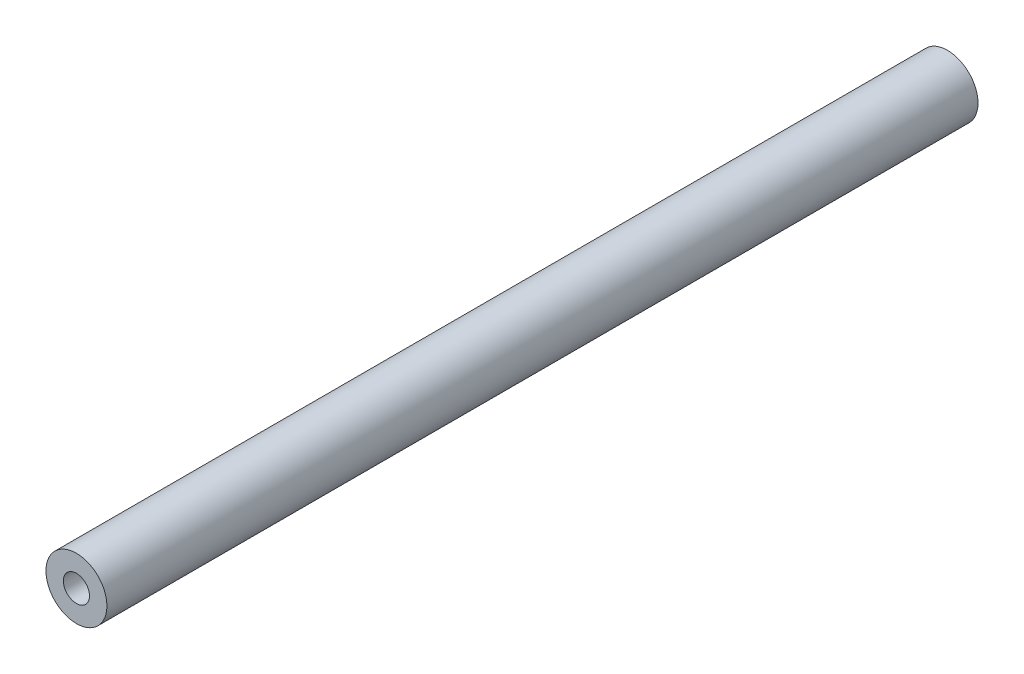
ISO-10303-21;
HEADER;
FILE_DESCRIPTION(('STEP AP214'),'2;1');
FILE_NAME('part.step','',(''),(''),'','','');
FILE_SCHEMA(('AUTOMOTIVE_DESIGN { 1 0 10303 214 1 1 1 1 }'));
ENDSEC;
DATA;
#1=APPLICATION_CONTEXT('core data for automotive mechanical design processes');
#2=APPLICATION_PROTOCOL_DEFINITION('international standard','automotive_design',2000,#1);
#3=PRODUCT_CONTEXT('',#1,'mechanical');
#4=PRODUCT('Part','Part','',(#3));
#5=PRODUCT_RELATED_PRODUCT_CATEGORY('part','',(#4));
#6=PRODUCT_DEFINITION_FORMATION('','',#4);
#7=PRODUCT_DEFINITION_CONTEXT('part definition',#1,'design');
#8=PRODUCT_DEFINITION('design','',#6,#7);
#9=PRODUCT_DEFINITION_SHAPE('','',#8);
#10=(LENGTH_UNIT() NAMED_UNIT(*) SI_UNIT(.MILLI.,.METRE.));
#11=(NAMED_UNIT(*) PLANE_ANGLE_UNIT() SI_UNIT($,.RADIAN.));
#12=(NAMED_UNIT(*) SI_UNIT($,.STERADIAN.) SOLID_ANGLE_UNIT());
#13=UNCERTAINTY_MEASURE_WITH_UNIT(LENGTH_MEASURE(1.E-05),#10,'distance_accuracy_value','');
#14=(GEOMETRIC_REPRESENTATION_CONTEXT(3) GLOBAL_UNCERTAINTY_ASSIGNED_CONTEXT((#13)) GLOBAL_UNIT_ASSIGNED_CONTEXT((#10,
#11,#12)) REPRESENTATION_CONTEXT('',''));
#15=CARTESIAN_POINT('',(0.,0.,0.));
#16=DIRECTION('',(0.,0.,1.));
#17=DIRECTION('',(1.,0.,0.));
#18=AXIS2_PLACEMENT_3D('',#15,#16,#17);
#19=CARTESIAN_POINT('',(0.,0.,100.));
#20=DIRECTION('',(0.,0.,1.));
#21=DIRECTION('',(1.,0.,0.));
#22=AXIS2_PLACEMENT_3D('',#19,#20,#21);
#23=PLANE('',#22);
#24=CARTESIAN_POINT('',(0.,0.,100.));
#25=DIRECTION('',(0.,0.,1.));
#26=DIRECTION('',(1.,0.,0.));
#27=AXIS2_PLACEMENT_3D('',#24,#25,#26);
#28=CIRCLE('',#27,3.5);
#29=CARTESIAN_POINT('',(3.5,0.,100.));
#30=VERTEX_POINT('',#29);
#31=EDGE_CURVE('E10',#30,#30,#28,.T.);
#32=ORIENTED_EDGE('',*,*,#31,.T.);
#33=EDGE_LOOP('',(#32));
#34=FACE_BOUND('',#33,.T.);
#35=CARTESIAN_POINT('',(0.,0.,100.));
#36=DIRECTION('',(0.,0.,1.));
#37=DIRECTION('',(1.,0.,0.));
#38=AXIS2_PLACEMENT_3D('',#35,#36,#37);
#39=CIRCLE('',#38,1.5);
#40=CARTESIAN_POINT('',(1.5,0.,100.));
#41=VERTEX_POINT('',#40);
#42=EDGE_CURVE('E42',#41,#41,#39,.T.);
#43=ORIENTED_EDGE('',*,*,#42,.F.);
#44=EDGE_LOOP('',(#43));
#45=FACE_BOUND('',#44,.T.);
#46=ADVANCED_FACE('F31',(#34,#45),#23,.T.);
#47=CARTESIAN_POINT('',(0.,0.,0.));
#48=DIRECTION('',(0.,0.,1.));
#49=DIRECTION('',(1.,0.,0.));
#50=AXIS2_PLACEMENT_3D('',#47,#48,#49);
#51=PLANE('',#50);
#52=CARTESIAN_POINT('',(0.,0.,0.));
#53=DIRECTION('',(0.,0.,1.));
#54=DIRECTION('',(1.,0.,0.));
#55=AXIS2_PLACEMENT_3D('',#52,#53,#54);
#56=CIRCLE('',#55,3.5);
#57=CARTESIAN_POINT('',(3.5,0.,0.));
#58=VERTEX_POINT('',#57);
#59=EDGE_CURVE('E35',#58,#58,#56,.T.);
#60=ORIENTED_EDGE('',*,*,#59,.F.);
#61=EDGE_LOOP('',(#60));
#62=FACE_BOUND('',#61,.T.);
#63=CARTESIAN_POINT('',(0.,0.,0.));
#64=DIRECTION('',(0.,0.,1.));
#65=DIRECTION('',(1.,0.,0.));
#66=AXIS2_PLACEMENT_3D('',#63,#64,#65);
#67=CIRCLE('',#66,1.5);
#68=CARTESIAN_POINT('',(1.5,0.,0.));
#69=VERTEX_POINT('',#68);
#70=EDGE_CURVE('E44',#69,#69,#67,.T.);
#71=ORIENTED_EDGE('',*,*,#70,.T.);
#72=EDGE_LOOP('',(#71));
#73=FACE_BOUND('',#72,.T.);
#74=ADVANCED_FACE('F54',(#62,#73),#51,.F.);
#75=CARTESIAN_POINT('',(0.,0.,100.));
#76=DIRECTION('',(0.,0.,-1.));
#77=DIRECTION('',(-1.,0.,0.));
#78=AXIS2_PLACEMENT_3D('',#75,#76,#77);
#79=CYLINDRICAL_SURFACE('',#78,3.5);
#80=ORIENTED_EDGE('',*,*,#31,.F.);
#81=EDGE_LOOP('',(#80));
#82=FACE_BOUND('',#81,.T.);
#83=ORIENTED_EDGE('',*,*,#59,.T.);
#84=EDGE_LOOP('',(#83));
#85=FACE_BOUND('',#84,.T.);
#86=ADVANCED_FACE('F33',(#82,#85),#79,.T.);
#87=CARTESIAN_POINT('',(0.,0.,100.));
#88=DIRECTION('',(0.,0.,-1.));
#89=DIRECTION('',(-1.,0.,0.));
#90=AXIS2_PLACEMENT_3D('',#87,#88,#89);
#91=CYLINDRICAL_SURFACE('',#90,1.5);
#92=ORIENTED_EDGE('',*,*,#42,.T.);
#93=EDGE_LOOP('',(#92));
#94=FACE_BOUND('',#93,.T.);
#95=ORIENTED_EDGE('',*,*,#70,.F.);
#96=EDGE_LOOP('',(#95));
#97=FACE_BOUND('',#96,.T.);
#98=ADVANCED_FACE('F50',(#94,#97),#91,.F.);
#99=CLOSED_SHELL('',(#46,#74,#86,#98));
#100=MANIFOLD_SOLID_BREP('B2',#99);
#101=ADVANCED_BREP_SHAPE_REPRESENTATION('',(#18,#100),#14);
#102=SHAPE_DEFINITION_REPRESENTATION(#9,#101);
ENDSEC;
END-ISO-10303-21;
